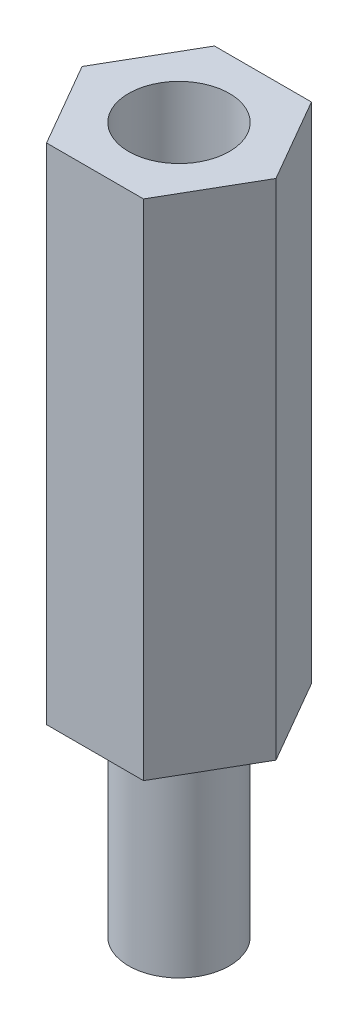
ISO-10303-21;
HEADER;
FILE_DESCRIPTION(('STEP AP214'),'2;1');
FILE_NAME('part.step','',(''),(''),'','','');
FILE_SCHEMA(('AUTOMOTIVE_DESIGN { 1 0 10303 214 1 1 1 1 }'));
ENDSEC;
DATA;
#1=APPLICATION_CONTEXT('core data for automotive mechanical design processes');
#2=APPLICATION_PROTOCOL_DEFINITION('international standard','automotive_design',2000,#1);
#3=PRODUCT_CONTEXT('',#1,'mechanical');
#4=PRODUCT('Part','Part','',(#3));
#5=PRODUCT_RELATED_PRODUCT_CATEGORY('part','',(#4));
#6=PRODUCT_DEFINITION_FORMATION('','',#4);
#7=PRODUCT_DEFINITION_CONTEXT('part definition',#1,'design');
#8=PRODUCT_DEFINITION('design','',#6,#7);
#9=PRODUCT_DEFINITION_SHAPE('','',#8);
#10=(LENGTH_UNIT() NAMED_UNIT(*) SI_UNIT(.MILLI.,.METRE.));
#11=(NAMED_UNIT(*) PLANE_ANGLE_UNIT() SI_UNIT($,.RADIAN.));
#12=(NAMED_UNIT(*) SI_UNIT($,.STERADIAN.) SOLID_ANGLE_UNIT());
#13=UNCERTAINTY_MEASURE_WITH_UNIT(LENGTH_MEASURE(1.E-05),#10,'distance_accuracy_value','');
#14=(GEOMETRIC_REPRESENTATION_CONTEXT(3) GLOBAL_UNCERTAINTY_ASSIGNED_CONTEXT((#13)) GLOBAL_UNIT_ASSIGNED_CONTEXT((#10,
#11,#12)) REPRESENTATION_CONTEXT('',''));
#15=CARTESIAN_POINT('',(0.,0.,0.));
#16=DIRECTION('',(0.,0.,1.));
#17=DIRECTION('',(1.,0.,0.));
#18=AXIS2_PLACEMENT_3D('',#15,#16,#17);
#19=CARTESIAN_POINT('',(0.,-6.,0.));
#20=DIRECTION('',(0.,1.,0.));
#21=DIRECTION('',(0.,0.,1.));
#22=AXIS2_PLACEMENT_3D('',#19,#20,#21);
#23=CYLINDRICAL_SURFACE('',#22,1.5);
#24=CARTESIAN_POINT('',(0.,-6.,0.));
#25=DIRECTION('',(0.,-1.,0.));
#26=DIRECTION('',(0.,0.,-1.));
#27=AXIS2_PLACEMENT_3D('',#24,#25,#26);
#28=CIRCLE('',#27,1.5);
#29=CARTESIAN_POINT('',(0.,-6.,-1.5));
#30=VERTEX_POINT('',#29);
#31=EDGE_CURVE('E11',#30,#30,#28,.T.);
#32=ORIENTED_EDGE('',*,*,#31,.F.);
#33=EDGE_LOOP('',(#32));
#34=FACE_BOUND('',#33,.T.);
#35=CARTESIAN_POINT('',(0.,0.,0.));
#36=DIRECTION('',(0.,-1.,0.));
#37=DIRECTION('',(0.,0.,-1.));
#38=AXIS2_PLACEMENT_3D('',#35,#36,#37);
#39=CIRCLE('',#38,1.5);
#40=CARTESIAN_POINT('',(0.,0.,-1.5));
#41=VERTEX_POINT('',#40);
#42=EDGE_CURVE('E48',#41,#41,#39,.T.);
#43=ORIENTED_EDGE('',*,*,#42,.T.);
#44=EDGE_LOOP('',(#43));
#45=FACE_BOUND('',#44,.T.);
#46=ADVANCED_FACE('F45',(#34,#45),#23,.T.);
#47=CARTESIAN_POINT('',(0.,-6.,0.));
#48=DIRECTION('',(0.,-1.,0.));
#49=DIRECTION('',(0.,0.,-1.));
#50=AXIS2_PLACEMENT_3D('',#47,#48,#49);
#51=PLANE('',#50);
#52=ORIENTED_EDGE('',*,*,#31,.T.);
#53=EDGE_LOOP('',(#52));
#54=FACE_BOUND('',#53,.T.);
#55=ADVANCED_FACE('F60',(#54),#51,.T.);
#56=CARTESIAN_POINT('',(0.,0.,0.));
#57=DIRECTION('',(0.,-1.,0.));
#58=DIRECTION('',(0.,0.,-1.));
#59=AXIS2_PLACEMENT_3D('',#56,#57,#58);
#60=PLANE('',#59);
#61=ORIENTED_EDGE('',*,*,#42,.F.);
#62=EDGE_LOOP('',(#61));
#63=FACE_BOUND('',#62,.T.);
#64=ADVANCED_FACE('F58',(#63),#60,.F.);
#65=CLOSED_SHELL('',(#46,#55,#64));
#66=MANIFOLD_SOLID_BREP('B2',#65);
#67=CARTESIAN_POINT('',(0.,15.,0.));
#68=DIRECTION('',(0.,1.,0.));
#69=DIRECTION('',(0.,0.,1.));
#70=AXIS2_PLACEMENT_3D('',#67,#68,#69);
#71=PLANE('',#70);
#72=DIRECTION('',(1.,0.,0.));
#73=VECTOR('',#72,1.);
#74=CARTESIAN_POINT('',(-1.44337567297405,15.,2.5));
#75=LINE('',#74,#73);
#76=CARTESIAN_POINT('',(-1.44337567297405,15.,2.5));
#77=VERTEX_POINT('',#76);
#78=CARTESIAN_POINT('',(1.44337567297408,15.,2.5));
#79=VERTEX_POINT('',#78);
#80=EDGE_CURVE('E176',#77,#79,#75,.T.);
#81=ORIENTED_EDGE('',*,*,#80,.T.);
#82=DIRECTION('',(0.500000000000001,0.,-0.866025403784438));
#83=VECTOR('',#82,1.);
#84=CARTESIAN_POINT('',(1.44337567297408,15.,2.5));
#85=LINE('',#84,#83);
#86=CARTESIAN_POINT('',(2.88675134594815,15.,0.));
#87=VERTEX_POINT('',#86);
#88=EDGE_CURVE('E134',#79,#87,#85,.T.);
#89=ORIENTED_EDGE('',*,*,#88,.T.);
#90=DIRECTION('',(-0.500000000000001,0.,-0.866025403784438));
#91=VECTOR('',#90,1.);
#92=CARTESIAN_POINT('',(2.88675134594815,15.,0.));
#93=LINE('',#92,#91);
#94=CARTESIAN_POINT('',(1.44337567297408,15.,-2.50000000000001));
#95=VERTEX_POINT('',#94);
#96=EDGE_CURVE('E147',#87,#95,#93,.T.);
#97=ORIENTED_EDGE('',*,*,#96,.T.);
#98=DIRECTION('',(-1.,0.,0.));
#99=VECTOR('',#98,1.);
#100=CARTESIAN_POINT('',(1.44337567297408,15.,-2.50000000000001));
#101=LINE('',#100,#99);
#102=CARTESIAN_POINT('',(-1.44337567297405,15.,-2.50000000000001));
#103=VERTEX_POINT('',#102);
#104=EDGE_CURVE('E141',#95,#103,#101,.T.);
#105=ORIENTED_EDGE('',*,*,#104,.T.);
#106=DIRECTION('',(-0.5,0.,0.866025403784438));
#107=VECTOR('',#106,1.);
#108=CARTESIAN_POINT('',(-1.44337567297405,15.,-2.50000000000001));
#109=LINE('',#108,#107);
#110=CARTESIAN_POINT('',(-2.88675134594812,15.,0.));
#111=VERTEX_POINT('',#110);
#112=EDGE_CURVE('E145',#103,#111,#109,.T.);
#113=ORIENTED_EDGE('',*,*,#112,.T.);
#114=DIRECTION('',(0.5,0.,0.866025403784438));
#115=VECTOR('',#114,1.);
#116=CARTESIAN_POINT('',(-2.88675134594812,15.,0.));
#117=LINE('',#116,#115);
#118=EDGE_CURVE('E97',#111,#77,#117,.T.);
#119=ORIENTED_EDGE('',*,*,#118,.T.);
#120=EDGE_LOOP('',(#81,#89,#97,#105,#113,#119));
#121=FACE_BOUND('',#120,.T.);
#122=CARTESIAN_POINT('',(0.,15.,0.));
#123=DIRECTION('',(0.,1.,0.));
#124=DIRECTION('',(0.,0.,1.));
#125=AXIS2_PLACEMENT_3D('',#122,#123,#124);
#126=CIRCLE('',#125,1.5);
#127=CARTESIAN_POINT('',(0.,15.,1.5));
#128=VERTEX_POINT('',#127);
#129=EDGE_CURVE('E169',#128,#128,#126,.T.);
#130=ORIENTED_EDGE('',*,*,#129,.F.);
#131=EDGE_LOOP('',(#130));
#132=FACE_BOUND('',#131,.T.);
#133=ADVANCED_FACE('F80',(#121,#132),#71,.T.);
#134=CARTESIAN_POINT('',(0.,0.,0.));
#135=DIRECTION('',(0.,1.,0.));
#136=DIRECTION('',(0.,0.,1.));
#137=AXIS2_PLACEMENT_3D('',#134,#135,#136);
#138=PLANE('',#137);
#139=DIRECTION('',(1.,0.,0.));
#140=VECTOR('',#139,1.);
#141=CARTESIAN_POINT('',(-1.44337567297405,0.,2.5));
#142=LINE('',#141,#140);
#143=CARTESIAN_POINT('',(-1.44337567297405,0.,2.5));
#144=VERTEX_POINT('',#143);
#145=CARTESIAN_POINT('',(1.44337567297408,0.,2.5));
#146=VERTEX_POINT('',#145);
#147=EDGE_CURVE('E165',#144,#146,#142,.T.);
#148=ORIENTED_EDGE('',*,*,#147,.F.);
#149=DIRECTION('',(0.5,0.,0.866025403784438));
#150=VECTOR('',#149,1.);
#151=CARTESIAN_POINT('',(-2.88675134594812,0.,0.));
#152=LINE('',#151,#150);
#153=CARTESIAN_POINT('',(-2.88675134594812,0.,0.));
#154=VERTEX_POINT('',#153);
#155=EDGE_CURVE('E126',#154,#144,#152,.T.);
#156=ORIENTED_EDGE('',*,*,#155,.F.);
#157=DIRECTION('',(-0.5,0.,0.866025403784438));
#158=VECTOR('',#157,1.);
#159=CARTESIAN_POINT('',(-1.44337567297405,0.,-2.50000000000001));
#160=LINE('',#159,#158);
#161=CARTESIAN_POINT('',(-1.44337567297405,0.,-2.50000000000001));
#162=VERTEX_POINT('',#161);
#163=EDGE_CURVE('E120',#162,#154,#160,.T.);
#164=ORIENTED_EDGE('',*,*,#163,.F.);
#165=DIRECTION('',(-1.,0.,0.));
#166=VECTOR('',#165,1.);
#167=CARTESIAN_POINT('',(1.44337567297408,0.,-2.50000000000001));
#168=LINE('',#167,#166);
#169=CARTESIAN_POINT('',(1.44337567297408,0.,-2.50000000000001));
#170=VERTEX_POINT('',#169);
#171=EDGE_CURVE('E155',#170,#162,#168,.T.);
#172=ORIENTED_EDGE('',*,*,#171,.F.);
#173=DIRECTION('',(-0.500000000000001,0.,-0.866025403784438));
#174=VECTOR('',#173,1.);
#175=CARTESIAN_POINT('',(2.88675134594815,0.,0.));
#176=LINE('',#175,#174);
#177=CARTESIAN_POINT('',(2.88675134594815,0.,0.));
#178=VERTEX_POINT('',#177);
#179=EDGE_CURVE('E171',#178,#170,#176,.T.);
#180=ORIENTED_EDGE('',*,*,#179,.F.);
#181=DIRECTION('',(0.500000000000001,0.,-0.866025403784438));
#182=VECTOR('',#181,1.);
#183=CARTESIAN_POINT('',(1.44337567297408,0.,2.5));
#184=LINE('',#183,#182);
#185=EDGE_CURVE('E168',#146,#178,#184,.T.);
#186=ORIENTED_EDGE('',*,*,#185,.F.);
#187=EDGE_LOOP('',(#148,#156,#164,#172,#180,#186));
#188=FACE_BOUND('',#187,.T.);
#189=CARTESIAN_POINT('',(0.,0.,0.));
#190=DIRECTION('',(0.,1.,0.));
#191=DIRECTION('',(0.,0.,1.));
#192=AXIS2_PLACEMENT_3D('',#189,#190,#191);
#193=CIRCLE('',#192,1.5);
#194=CARTESIAN_POINT('',(0.,0.,1.5));
#195=VERTEX_POINT('',#194);
#196=EDGE_CURVE('E251',#195,#195,#193,.T.);
#197=ORIENTED_EDGE('',*,*,#196,.T.);
#198=EDGE_LOOP('',(#197));
#199=FACE_BOUND('',#198,.T.);
#200=ADVANCED_FACE('F185',(#188,#199),#138,.F.);
#201=CARTESIAN_POINT('',(-1.44337567297405,15.,2.5));
#202=DIRECTION('',(0.,0.,-1.));
#203=DIRECTION('',(-1.,0.,0.));
#204=AXIS2_PLACEMENT_3D('',#201,#202,#203);
#205=PLANE('',#204);
#206=ORIENTED_EDGE('',*,*,#147,.T.);
#207=DIRECTION('',(0.,-1.,0.));
#208=VECTOR('',#207,1.);
#209=CARTESIAN_POINT('',(1.44337567297408,15.,2.5));
#210=LINE('',#209,#208);
#211=EDGE_CURVE('E43',#79,#146,#210,.T.);
#212=ORIENTED_EDGE('',*,*,#211,.F.);
#213=ORIENTED_EDGE('',*,*,#80,.F.);
#214=DIRECTION('',(0.,-1.,0.));
#215=VECTOR('',#214,1.);
#216=CARTESIAN_POINT('',(-1.44337567297405,15.,2.5));
#217=LINE('',#216,#215);
#218=EDGE_CURVE('E161',#77,#144,#217,.T.);
#219=ORIENTED_EDGE('',*,*,#218,.T.);
#220=EDGE_LOOP('',(#206,#212,#213,#219));
#221=FACE_BOUND('',#220,.T.);
#222=ADVANCED_FACE('F82',(#221),#205,.F.);
#223=CARTESIAN_POINT('',(1.44337567297408,15.,2.5));
#224=DIRECTION('',(-0.866025403784438,0.,-0.500000000000001));
#225=DIRECTION('',(-0.500000000000001,0.,0.866025403784438));
#226=AXIS2_PLACEMENT_3D('',#223,#224,#225);
#227=PLANE('',#226);
#228=ORIENTED_EDGE('',*,*,#185,.T.);
#229=DIRECTION('',(0.,-1.,0.));
#230=VECTOR('',#229,1.);
#231=CARTESIAN_POINT('',(2.88675134594815,15.,0.));
#232=LINE('',#231,#230);
#233=EDGE_CURVE('E89',#87,#178,#232,.T.);
#234=ORIENTED_EDGE('',*,*,#233,.F.);
#235=ORIENTED_EDGE('',*,*,#88,.F.);
#236=ORIENTED_EDGE('',*,*,#211,.T.);
#237=EDGE_LOOP('',(#228,#234,#235,#236));
#238=FACE_BOUND('',#237,.T.);
#239=ADVANCED_FACE('F210',(#238),#227,.F.);
#240=CARTESIAN_POINT('',(2.88675134594815,15.,0.));
#241=DIRECTION('',(-0.866025403784438,0.,0.500000000000001));
#242=DIRECTION('',(0.500000000000001,0.,0.866025403784438));
#243=AXIS2_PLACEMENT_3D('',#240,#241,#242);
#244=PLANE('',#243);
#245=ORIENTED_EDGE('',*,*,#179,.T.);
#246=DIRECTION('',(0.,-1.,0.));
#247=VECTOR('',#246,1.);
#248=CARTESIAN_POINT('',(1.44337567297408,15.,-2.50000000000001));
#249=LINE('',#248,#247);
#250=EDGE_CURVE('E156',#95,#170,#249,.T.);
#251=ORIENTED_EDGE('',*,*,#250,.F.);
#252=ORIENTED_EDGE('',*,*,#96,.F.);
#253=ORIENTED_EDGE('',*,*,#233,.T.);
#254=EDGE_LOOP('',(#245,#251,#252,#253));
#255=FACE_BOUND('',#254,.T.);
#256=ADVANCED_FACE('F182',(#255),#244,.F.);
#257=CARTESIAN_POINT('',(1.44337567297408,15.,-2.50000000000001));
#258=DIRECTION('',(0.,0.,1.));
#259=DIRECTION('',(1.,0.,0.));
#260=AXIS2_PLACEMENT_3D('',#257,#258,#259);
#261=PLANE('',#260);
#262=ORIENTED_EDGE('',*,*,#171,.T.);
#263=DIRECTION('',(0.,-1.,0.));
#264=VECTOR('',#263,1.);
#265=CARTESIAN_POINT('',(-1.44337567297405,15.,-2.50000000000001));
#266=LINE('',#265,#264);
#267=EDGE_CURVE('E152',#103,#162,#266,.T.);
#268=ORIENTED_EDGE('',*,*,#267,.F.);
#269=ORIENTED_EDGE('',*,*,#104,.F.);
#270=ORIENTED_EDGE('',*,*,#250,.T.);
#271=EDGE_LOOP('',(#262,#268,#269,#270));
#272=FACE_BOUND('',#271,.T.);
#273=ADVANCED_FACE('F153',(#272),#261,.F.);
#274=CARTESIAN_POINT('',(-1.44337567297405,15.,-2.50000000000001));
#275=DIRECTION('',(0.866025403784439,0.,0.5));
#276=DIRECTION('',(0.5,0.,-0.866025403784439));
#277=AXIS2_PLACEMENT_3D('',#274,#275,#276);
#278=PLANE('',#277);
#279=ORIENTED_EDGE('',*,*,#163,.T.);
#280=DIRECTION('',(0.,-1.,0.));
#281=VECTOR('',#280,1.);
#282=CARTESIAN_POINT('',(-2.88675134594812,15.,0.));
#283=LINE('',#282,#281);
#284=EDGE_CURVE('E157',#111,#154,#283,.T.);
#285=ORIENTED_EDGE('',*,*,#284,.F.);
#286=ORIENTED_EDGE('',*,*,#112,.F.);
#287=ORIENTED_EDGE('',*,*,#267,.T.);
#288=EDGE_LOOP('',(#279,#285,#286,#287));
#289=FACE_BOUND('',#288,.T.);
#290=ADVANCED_FACE('F159',(#289),#278,.F.);
#291=CARTESIAN_POINT('',(-2.88675134594812,15.,0.));
#292=DIRECTION('',(0.866025403784438,0.,-0.5));
#293=DIRECTION('',(-0.5,0.,-0.866025403784438));
#294=AXIS2_PLACEMENT_3D('',#291,#292,#293);
#295=PLANE('',#294);
#296=ORIENTED_EDGE('',*,*,#155,.T.);
#297=ORIENTED_EDGE('',*,*,#218,.F.);
#298=ORIENTED_EDGE('',*,*,#118,.F.);
#299=ORIENTED_EDGE('',*,*,#284,.T.);
#300=EDGE_LOOP('',(#296,#297,#298,#299));
#301=FACE_BOUND('',#300,.T.);
#302=ADVANCED_FACE('F190',(#301),#295,.F.);
#303=CARTESIAN_POINT('',(0.,15.,0.));
#304=DIRECTION('',(0.,-1.,0.));
#305=DIRECTION('',(0.,0.,-1.));
#306=AXIS2_PLACEMENT_3D('',#303,#304,#305);
#307=CYLINDRICAL_SURFACE('',#306,1.5);
#308=ORIENTED_EDGE('',*,*,#129,.T.);
#309=EDGE_LOOP('',(#308));
#310=FACE_BOUND('',#309,.T.);
#311=ORIENTED_EDGE('',*,*,#196,.F.);
#312=EDGE_LOOP('',(#311));
#313=FACE_BOUND('',#312,.T.);
#314=ADVANCED_FACE('F192',(#310,#313),#307,.F.);
#315=CLOSED_SHELL('',(#133,#200,#222,#239,#256,#273,#290,#302,#314));
#316=MANIFOLD_SOLID_BREP('B6',#315);
#317=ADVANCED_BREP_SHAPE_REPRESENTATION('',(#18,#66,#316),#14);
#318=SHAPE_DEFINITION_REPRESENTATION(#9,#317);
ENDSEC;
END-ISO-10303-21;
